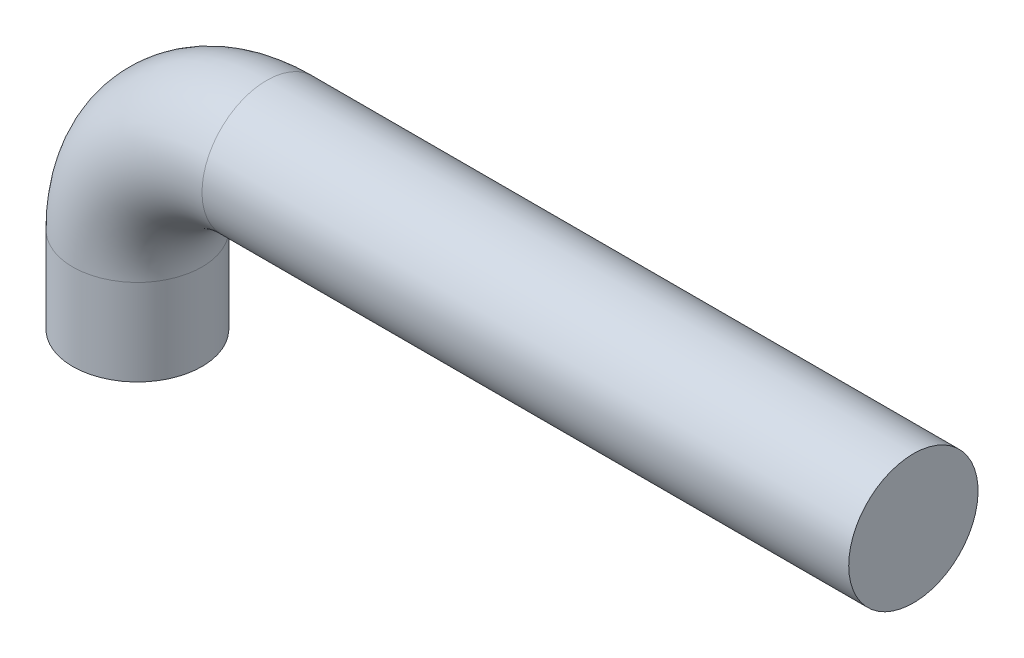
ISO-10303-21;
HEADER;
FILE_DESCRIPTION(('STEP AP214'),'2;1');
FILE_NAME('part.step','',(''),(''),'','','');
FILE_SCHEMA(('AUTOMOTIVE_DESIGN { 1 0 10303 214 1 1 1 1 }'));
ENDSEC;
DATA;
#1=APPLICATION_CONTEXT('core data for automotive mechanical design processes');
#2=APPLICATION_PROTOCOL_DEFINITION('international standard','automotive_design',2000,#1);
#3=PRODUCT_CONTEXT('',#1,'mechanical');
#4=PRODUCT('Part','Part','',(#3));
#5=PRODUCT_RELATED_PRODUCT_CATEGORY('part','',(#4));
#6=PRODUCT_DEFINITION_FORMATION('','',#4);
#7=PRODUCT_DEFINITION_CONTEXT('part definition',#1,'design');
#8=PRODUCT_DEFINITION('design','',#6,#7);
#9=PRODUCT_DEFINITION_SHAPE('','',#8);
#10=(LENGTH_UNIT() NAMED_UNIT(*) SI_UNIT(.MILLI.,.METRE.));
#11=(NAMED_UNIT(*) PLANE_ANGLE_UNIT() SI_UNIT($,.RADIAN.));
#12=(NAMED_UNIT(*) SI_UNIT($,.STERADIAN.) SOLID_ANGLE_UNIT());
#13=UNCERTAINTY_MEASURE_WITH_UNIT(LENGTH_MEASURE(1.E-05),#10,'distance_accuracy_value','');
#14=(GEOMETRIC_REPRESENTATION_CONTEXT(3) GLOBAL_UNCERTAINTY_ASSIGNED_CONTEXT((#13)) GLOBAL_UNIT_ASSIGNED_CONTEXT((#10,
#11,#12)) REPRESENTATION_CONTEXT('',''));
#15=CARTESIAN_POINT('',(0.,0.,0.));
#16=DIRECTION('',(0.,0.,1.));
#17=DIRECTION('',(1.,0.,0.));
#18=AXIS2_PLACEMENT_3D('',#15,#16,#17);
#19=CARTESIAN_POINT('',(0.,0.,0.));
#20=DIRECTION('',(0.,1.,0.));
#21=DIRECTION('',(0.,0.,1.));
#22=AXIS2_PLACEMENT_3D('',#19,#20,#21);
#23=PLANE('',#22);
#24=CARTESIAN_POINT('',(0.,0.,0.));
#25=DIRECTION('',(0.,1.,0.));
#26=DIRECTION('',(0.,0.,1.));
#27=AXIS2_PLACEMENT_3D('',#24,#25,#26);
#28=CIRCLE('',#27,3.);
#29=CARTESIAN_POINT('',(0.,0.,3.));
#30=VERTEX_POINT('',#29);
#31=EDGE_CURVE('E58',#30,#30,#28,.T.);
#32=ORIENTED_EDGE('',*,*,#31,.F.);
#33=EDGE_LOOP('',(#32));
#34=FACE_BOUND('',#33,.T.);
#35=ADVANCED_FACE('F41',(#34),#23,.F.);
#36=CARTESIAN_POINT('',(36.,10.,0.));
#37=DIRECTION('',(1.,0.,0.));
#38=DIRECTION('',(0.,0.,1.));
#39=AXIS2_PLACEMENT_3D('',#36,#37,#38);
#40=PLANE('',#39);
#41=CARTESIAN_POINT('',(36.,10.,0.));
#42=DIRECTION('',(1.,0.,0.));
#43=DIRECTION('',(0.,0.,1.));
#44=AXIS2_PLACEMENT_3D('',#41,#42,#43);
#45=CIRCLE('',#44,3.);
#46=CARTESIAN_POINT('',(36.,10.,3.));
#47=VERTEX_POINT('',#46);
#48=EDGE_CURVE('E10',#47,#47,#45,.T.);
#49=ORIENTED_EDGE('',*,*,#48,.T.);
#50=EDGE_LOOP('',(#49));
#51=FACE_BOUND('',#50,.T.);
#52=ADVANCED_FACE('F68',(#51),#40,.T.);
#53=CARTESIAN_POINT('',(0.,0.,0.));
#54=DIRECTION('',(0.,1.,0.));
#55=DIRECTION('',(0.,0.,1.));
#56=AXIS2_PLACEMENT_3D('',#53,#54,#55);
#57=CYLINDRICAL_SURFACE('',#56,3.);
#58=CARTESIAN_POINT('',(0.,4.,0.));
#59=DIRECTION('',(0.,1.,0.));
#60=DIRECTION('',(0.,0.,1.));
#61=AXIS2_PLACEMENT_3D('',#58,#59,#60);
#62=CIRCLE('',#61,3.);
#63=CARTESIAN_POINT('',(-3.,4.,0.));
#64=VERTEX_POINT('',#63);
#65=EDGE_CURVE('E53',#64,#64,#62,.T.);
#66=ORIENTED_EDGE('',*,*,#65,.F.);
#67=EDGE_LOOP('',(#66));
#68=FACE_BOUND('',#67,.T.);
#69=ORIENTED_EDGE('',*,*,#31,.T.);
#70=EDGE_LOOP('',(#69));
#71=FACE_BOUND('',#70,.T.);
#72=ADVANCED_FACE('F65',(#68,#71),#57,.T.);
#73=CARTESIAN_POINT('',(6.,4.,0.));
#74=DIRECTION('',(0.,0.,-1.));
#75=DIRECTION('',(-1.,0.,0.));
#76=AXIS2_PLACEMENT_3D('',#73,#74,#75);
#77=TOROIDAL_SURFACE('',#76,6.,3.);
#78=CARTESIAN_POINT('',(6.,10.,0.));
#79=DIRECTION('',(1.,0.,0.));
#80=DIRECTION('',(0.,0.,1.));
#81=AXIS2_PLACEMENT_3D('',#78,#79,#80);
#82=CIRCLE('',#81,3.);
#83=CARTESIAN_POINT('',(6.,13.,0.));
#84=VERTEX_POINT('',#83);
#85=EDGE_CURVE('E48',#84,#84,#82,.T.);
#86=CARTESIAN_POINT('',(6.,4.,0.));
#87=DIRECTION('',(0.,0.,-1.));
#88=DIRECTION('',(-1.,0.,0.));
#89=AXIS2_PLACEMENT_3D('',#86,#87,#88);
#90=CIRCLE('',#89,9.);
#91=EDGE_CURVE('',#64,#84,#90,.T.);
#92=ORIENTED_EDGE('',*,*,#65,.T.);
#93=ORIENTED_EDGE('',*,*,#85,.F.);
#94=ORIENTED_EDGE('',*,*,#91,.T.);
#95=ORIENTED_EDGE('',*,*,#91,.F.);
#96=EDGE_LOOP('',(#92,#94,#93,#95));
#97=FACE_BOUND('',#96,.T.);
#98=ADVANCED_FACE('F74',(#97),#77,.T.);
#99=CARTESIAN_POINT('',(6.,10.,0.));
#100=DIRECTION('',(1.,0.,0.));
#101=DIRECTION('',(0.,0.,-1.));
#102=AXIS2_PLACEMENT_3D('',#99,#100,#101);
#103=CYLINDRICAL_SURFACE('',#102,3.);
#104=ORIENTED_EDGE('',*,*,#48,.F.);
#105=EDGE_LOOP('',(#104));
#106=FACE_BOUND('',#105,.T.);
#107=ORIENTED_EDGE('',*,*,#85,.T.);
#108=EDGE_LOOP('',(#107));
#109=FACE_BOUND('',#108,.T.);
#110=ADVANCED_FACE('F72',(#106,#109),#103,.T.);
#111=CLOSED_SHELL('',(#35,#52,#72,#98,#110));
#112=MANIFOLD_SOLID_BREP('B2',#111);
#113=ADVANCED_BREP_SHAPE_REPRESENTATION('',(#18,#112),#14);
#114=SHAPE_DEFINITION_REPRESENTATION(#9,#113);
ENDSEC;
END-ISO-10303-21;
